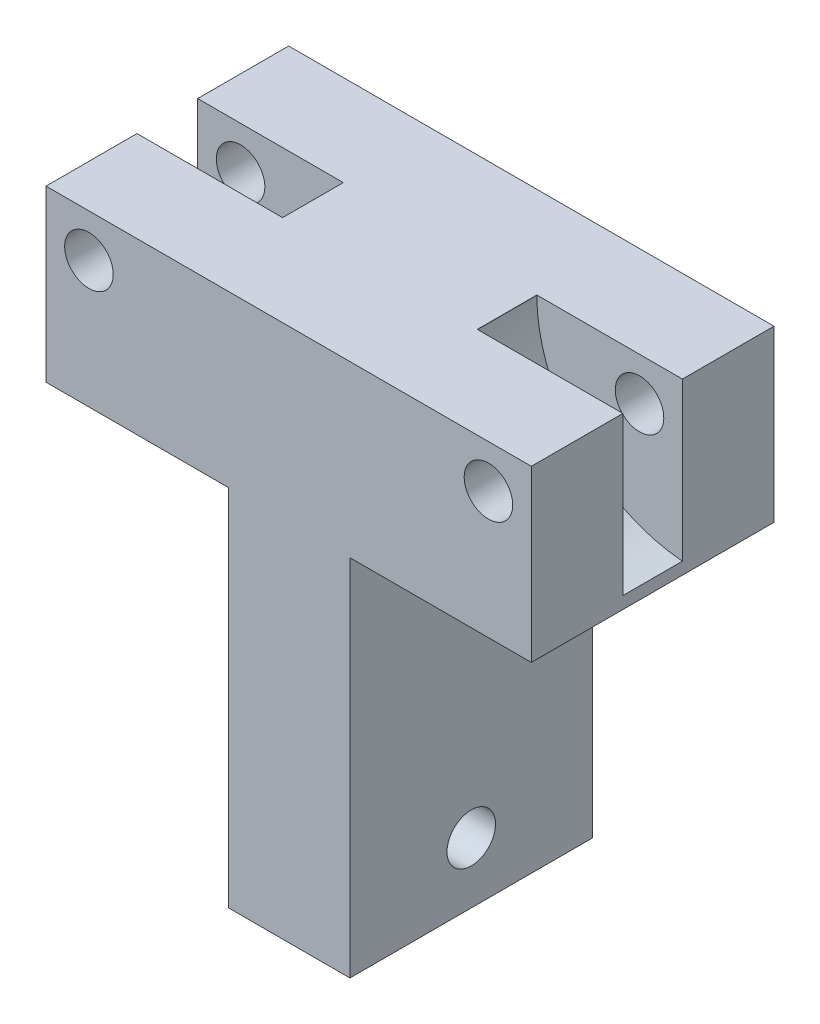
ISO-10303-21;
HEADER;
FILE_DESCRIPTION(('STEP AP214'),'2;1');
FILE_NAME('part.step','',(''),(''),'','','');
FILE_SCHEMA(('AUTOMOTIVE_DESIGN { 1 0 10303 214 1 1 1 1 }'));
ENDSEC;
DATA;
#1=APPLICATION_CONTEXT('core data for automotive mechanical design processes');
#2=APPLICATION_PROTOCOL_DEFINITION('international standard','automotive_design',2000,#1);
#3=PRODUCT_CONTEXT('',#1,'mechanical');
#4=PRODUCT('Part','Part','',(#3));
#5=PRODUCT_RELATED_PRODUCT_CATEGORY('part','',(#4));
#6=PRODUCT_DEFINITION_FORMATION('','',#4);
#7=PRODUCT_DEFINITION_CONTEXT('part definition',#1,'design');
#8=PRODUCT_DEFINITION('design','',#6,#7);
#9=PRODUCT_DEFINITION_SHAPE('','',#8);
#10=(LENGTH_UNIT() NAMED_UNIT(*) SI_UNIT(.MILLI.,.METRE.));
#11=(NAMED_UNIT(*) PLANE_ANGLE_UNIT() SI_UNIT($,.RADIAN.));
#12=(NAMED_UNIT(*) SI_UNIT($,.STERADIAN.) SOLID_ANGLE_UNIT());
#13=UNCERTAINTY_MEASURE_WITH_UNIT(LENGTH_MEASURE(1.E-05),#10,'distance_accuracy_value','');
#14=(GEOMETRIC_REPRESENTATION_CONTEXT(3) GLOBAL_UNCERTAINTY_ASSIGNED_CONTEXT((#13)) GLOBAL_UNIT_ASSIGNED_CONTEXT((#10,
#11,#12)) REPRESENTATION_CONTEXT('',''));
#15=CARTESIAN_POINT('',(0.,0.,0.));
#16=DIRECTION('',(0.,0.,1.));
#17=DIRECTION('',(1.,0.,0.));
#18=AXIS2_PLACEMENT_3D('',#15,#16,#17);
#19=CARTESIAN_POINT('',(2.5,15.,-10.));
#20=DIRECTION('',(-1.,0.,0.));
#21=DIRECTION('',(0.,0.,1.));
#22=AXIS2_PLACEMENT_3D('',#19,#20,#21);
#23=PLANE('',#22);
#24=CARTESIAN_POINT('',(2.5,2.5,-5.));
#25=DIRECTION('',(1.,0.,0.));
#26=DIRECTION('',(0.,0.,-1.));
#27=AXIS2_PLACEMENT_3D('',#24,#25,#26);
#28=CIRCLE('',#27,1.);
#29=CARTESIAN_POINT('',(2.5,2.5,-6.));
#30=VERTEX_POINT('',#29);
#31=EDGE_CURVE('E238',#30,#30,#28,.T.);
#32=ORIENTED_EDGE('',*,*,#31,.F.);
#33=EDGE_LOOP('',(#32));
#34=FACE_BOUND('',#33,.T.);
#35=DIRECTION('',(0.,0.,-1.));
#36=VECTOR('',#35,1.);
#37=CARTESIAN_POINT('',(2.5,0.,-10.));
#38=LINE('',#37,#36);
#39=CARTESIAN_POINT('',(2.5,0.,0.));
#40=VERTEX_POINT('',#39);
#41=CARTESIAN_POINT('',(2.5,0.,-10.));
#42=VERTEX_POINT('',#41);
#43=EDGE_CURVE('E242',#40,#42,#38,.T.);
#44=ORIENTED_EDGE('',*,*,#43,.T.);
#45=DIRECTION('',(0.,-1.,0.));
#46=VECTOR('',#45,1.);
#47=CARTESIAN_POINT('',(2.5,15.,-10.));
#48=LINE('',#47,#46);
#49=CARTESIAN_POINT('',(2.5,15.,-10.));
#50=VERTEX_POINT('',#49);
#51=EDGE_CURVE('E268',#50,#42,#48,.T.);
#52=ORIENTED_EDGE('',*,*,#51,.F.);
#53=DIRECTION('',(0.,0.,-1.));
#54=VECTOR('',#53,1.);
#55=CARTESIAN_POINT('',(2.5,15.,-10.));
#56=LINE('',#55,#54);
#57=CARTESIAN_POINT('',(2.5,15.,0.));
#58=VERTEX_POINT('',#57);
#59=EDGE_CURVE('E245',#58,#50,#56,.T.);
#60=ORIENTED_EDGE('',*,*,#59,.F.);
#61=DIRECTION('',(0.,-1.,0.));
#62=VECTOR('',#61,1.);
#63=CARTESIAN_POINT('',(2.5,15.,0.));
#64=LINE('',#63,#62);
#65=EDGE_CURVE('E252',#58,#40,#64,.T.);
#66=ORIENTED_EDGE('',*,*,#65,.T.);
#67=EDGE_LOOP('',(#44,#52,#60,#66));
#68=FACE_BOUND('',#67,.T.);
#69=ADVANCED_FACE('F37',(#34,#68),#23,.F.);
#70=CARTESIAN_POINT('',(-2.5,15.,-10.));
#71=DIRECTION('',(0.,0.,1.));
#72=DIRECTION('',(1.,0.,0.));
#73=AXIS2_PLACEMENT_3D('',#70,#71,#72);
#74=PLANE('',#73);
#75=CARTESIAN_POINT('',(8.20740930189963,20.2322330470336,-10.));
#76=DIRECTION('',(0.,0.,-1.));
#77=DIRECTION('',(-1.,0.,0.));
#78=AXIS2_PLACEMENT_3D('',#75,#76,#77);
#79=CIRCLE('',#78,1.);
#80=CARTESIAN_POINT('',(7.20740930189963,20.2322330470336,-10.));
#81=VERTEX_POINT('',#80);
#82=EDGE_CURVE('E301',#81,#81,#79,.T.);
#83=ORIENTED_EDGE('',*,*,#82,.F.);
#84=EDGE_LOOP('',(#83));
#85=FACE_BOUND('',#84,.T.);
#86=CARTESIAN_POINT('',(-8.25705679216763,20.2322330470336,-10.));
#87=DIRECTION('',(0.,0.,-1.));
#88=DIRECTION('',(-1.,0.,0.));
#89=AXIS2_PLACEMENT_3D('',#86,#87,#88);
#90=CIRCLE('',#89,1.);
#91=CARTESIAN_POINT('',(-9.25705679216763,20.2322330470336,-10.));
#92=VERTEX_POINT('',#91);
#93=EDGE_CURVE('E167',#92,#92,#90,.T.);
#94=ORIENTED_EDGE('',*,*,#93,.F.);
#95=EDGE_LOOP('',(#94));
#96=FACE_BOUND('',#95,.T.);
#97=DIRECTION('',(-1.,0.,0.));
#98=VECTOR('',#97,1.);
#99=CARTESIAN_POINT('',(-2.5,0.,-10.));
#100=LINE('',#99,#98);
#101=CARTESIAN_POINT('',(-2.5,0.,-10.));
#102=VERTEX_POINT('',#101);
#103=EDGE_CURVE('E255',#42,#102,#100,.T.);
#104=ORIENTED_EDGE('',*,*,#103,.T.);
#105=DIRECTION('',(0.,-1.,0.));
#106=VECTOR('',#105,1.);
#107=CARTESIAN_POINT('',(-2.5,15.,-10.));
#108=LINE('',#107,#106);
#109=CARTESIAN_POINT('',(-2.5,15.,-10.));
#110=VERTEX_POINT('',#109);
#111=EDGE_CURVE('E265',#110,#102,#108,.T.);
#112=ORIENTED_EDGE('',*,*,#111,.F.);
#113=DIRECTION('',(-1.,0.,0.));
#114=VECTOR('',#113,1.);
#115=CARTESIAN_POINT('',(-10.024823745134,15.,-10.));
#116=LINE('',#115,#114);
#117=CARTESIAN_POINT('',(-10.024823745134,15.,-10.));
#118=VERTEX_POINT('',#117);
#119=EDGE_CURVE('E217',#110,#118,#116,.T.);
#120=ORIENTED_EDGE('',*,*,#119,.T.);
#121=DIRECTION('',(0.,-1.,0.));
#122=VECTOR('',#121,1.);
#123=CARTESIAN_POINT('',(-10.024823745134,22.,-10.));
#124=LINE('',#123,#122);
#125=CARTESIAN_POINT('',(-10.024823745134,22.,-10.));
#126=VERTEX_POINT('',#125);
#127=EDGE_CURVE('E232',#126,#118,#124,.T.);
#128=ORIENTED_EDGE('',*,*,#127,.F.);
#129=DIRECTION('',(-1.,0.,0.));
#130=VECTOR('',#129,1.);
#131=CARTESIAN_POINT('',(-10.024823745134,22.,-10.));
#132=LINE('',#131,#130);
#133=CARTESIAN_POINT('',(9.97517625486601,22.,-10.));
#134=VERTEX_POINT('',#133);
#135=EDGE_CURVE('E205',#134,#126,#132,.T.);
#136=ORIENTED_EDGE('',*,*,#135,.F.);
#137=DIRECTION('',(0.,-1.,0.));
#138=VECTOR('',#137,1.);
#139=CARTESIAN_POINT('',(9.97517625486601,22.,-10.));
#140=LINE('',#139,#138);
#141=CARTESIAN_POINT('',(9.97517625486601,15.,-10.));
#142=VERTEX_POINT('',#141);
#143=EDGE_CURVE('E235',#134,#142,#140,.T.);
#144=ORIENTED_EDGE('',*,*,#143,.T.);
#145=EDGE_CURVE('E218',#142,#50,#116,.T.);
#146=ORIENTED_EDGE('',*,*,#145,.T.);
#147=ORIENTED_EDGE('',*,*,#51,.T.);
#148=EDGE_LOOP('',(#104,#112,#120,#128,#136,#144,#146,#147));
#149=FACE_BOUND('',#148,.T.);
#150=ADVANCED_FACE('F328',(#85,#96,#149),#74,.F.);
#151=CARTESIAN_POINT('',(-2.5,15.,0.));
#152=DIRECTION('',(1.,0.,0.));
#153=DIRECTION('',(0.,0.,-1.));
#154=AXIS2_PLACEMENT_3D('',#151,#152,#153);
#155=PLANE('',#154);
#156=CARTESIAN_POINT('',(-2.5,2.5,-5.));
#157=DIRECTION('',(1.,0.,0.));
#158=DIRECTION('',(0.,0.,-1.));
#159=AXIS2_PLACEMENT_3D('',#156,#157,#158);
#160=CIRCLE('',#159,1.);
#161=CARTESIAN_POINT('',(-2.5,2.5,-6.));
#162=VERTEX_POINT('',#161);
#163=EDGE_CURVE('E239',#162,#162,#160,.T.);
#164=ORIENTED_EDGE('',*,*,#163,.T.);
#165=EDGE_LOOP('',(#164));
#166=FACE_BOUND('',#165,.T.);
#167=DIRECTION('',(0.,0.,1.));
#168=VECTOR('',#167,1.);
#169=CARTESIAN_POINT('',(-2.5,0.,0.));
#170=LINE('',#169,#168);
#171=CARTESIAN_POINT('',(-2.5,0.,0.));
#172=VERTEX_POINT('',#171);
#173=EDGE_CURVE('E257',#102,#172,#170,.T.);
#174=ORIENTED_EDGE('',*,*,#173,.T.);
#175=DIRECTION('',(0.,-1.,0.));
#176=VECTOR('',#175,1.);
#177=CARTESIAN_POINT('',(-2.5,15.,0.));
#178=LINE('',#177,#176);
#179=CARTESIAN_POINT('',(-2.5,15.,0.));
#180=VERTEX_POINT('',#179);
#181=EDGE_CURVE('E262',#180,#172,#178,.T.);
#182=ORIENTED_EDGE('',*,*,#181,.F.);
#183=DIRECTION('',(0.,0.,1.));
#184=VECTOR('',#183,1.);
#185=CARTESIAN_POINT('',(-2.5,15.,0.));
#186=LINE('',#185,#184);
#187=EDGE_CURVE('E248',#110,#180,#186,.T.);
#188=ORIENTED_EDGE('',*,*,#187,.F.);
#189=ORIENTED_EDGE('',*,*,#111,.T.);
#190=EDGE_LOOP('',(#174,#182,#188,#189));
#191=FACE_BOUND('',#190,.T.);
#192=ADVANCED_FACE('F336',(#166,#191),#155,.F.);
#193=CARTESIAN_POINT('',(-2.5,15.,0.));
#194=DIRECTION('',(0.,0.,-1.));
#195=DIRECTION('',(-1.,0.,0.));
#196=AXIS2_PLACEMENT_3D('',#193,#194,#195);
#197=PLANE('',#196);
#198=CARTESIAN_POINT('',(8.20740930189964,20.2322330470336,0.));
#199=DIRECTION('',(0.,0.,-1.));
#200=DIRECTION('',(-1.,0.,0.));
#201=AXIS2_PLACEMENT_3D('',#198,#199,#200);
#202=CIRCLE('',#201,1.);
#203=CARTESIAN_POINT('',(7.20740930189964,20.2322330470336,0.));
#204=VERTEX_POINT('',#203);
#205=EDGE_CURVE('E278',#204,#204,#202,.T.);
#206=ORIENTED_EDGE('',*,*,#205,.T.);
#207=EDGE_LOOP('',(#206));
#208=FACE_BOUND('',#207,.T.);
#209=CARTESIAN_POINT('',(-8.25705679216762,20.2322330470336,0.));
#210=DIRECTION('',(0.,0.,-1.));
#211=DIRECTION('',(-1.,0.,0.));
#212=AXIS2_PLACEMENT_3D('',#209,#210,#211);
#213=CIRCLE('',#212,1.);
#214=CARTESIAN_POINT('',(-9.25705679216762,20.2322330470336,0.));
#215=VERTEX_POINT('',#214);
#216=EDGE_CURVE('E170',#215,#215,#213,.T.);
#217=ORIENTED_EDGE('',*,*,#216,.T.);
#218=EDGE_LOOP('',(#217));
#219=FACE_BOUND('',#218,.T.);
#220=DIRECTION('',(1.,0.,0.));
#221=VECTOR('',#220,1.);
#222=CARTESIAN_POINT('',(-2.5,0.,0.));
#223=LINE('',#222,#221);
#224=EDGE_CURVE('E249',#172,#40,#223,.T.);
#225=ORIENTED_EDGE('',*,*,#224,.T.);
#226=ORIENTED_EDGE('',*,*,#65,.F.);
#227=DIRECTION('',(1.,0.,0.));
#228=VECTOR('',#227,1.);
#229=CARTESIAN_POINT('',(9.97517625486601,15.,0.));
#230=LINE('',#229,#228);
#231=CARTESIAN_POINT('',(9.97517625486601,15.,0.));
#232=VERTEX_POINT('',#231);
#233=EDGE_CURVE('E223',#58,#232,#230,.T.);
#234=ORIENTED_EDGE('',*,*,#233,.T.);
#235=DIRECTION('',(0.,-1.,0.));
#236=VECTOR('',#235,1.);
#237=CARTESIAN_POINT('',(9.97517625486601,22.,0.));
#238=LINE('',#237,#236);
#239=CARTESIAN_POINT('',(9.97517625486601,22.,0.));
#240=VERTEX_POINT('',#239);
#241=EDGE_CURVE('E214',#240,#232,#238,.T.);
#242=ORIENTED_EDGE('',*,*,#241,.F.);
#243=DIRECTION('',(1.,0.,0.));
#244=VECTOR('',#243,1.);
#245=CARTESIAN_POINT('',(9.97517625486601,22.,0.));
#246=LINE('',#245,#244);
#247=CARTESIAN_POINT('',(-10.024823745134,22.,0.));
#248=VERTEX_POINT('',#247);
#249=EDGE_CURVE('E212',#248,#240,#246,.T.);
#250=ORIENTED_EDGE('',*,*,#249,.F.);
#251=DIRECTION('',(0.,-1.,0.));
#252=VECTOR('',#251,1.);
#253=CARTESIAN_POINT('',(-10.024823745134,22.,0.));
#254=LINE('',#253,#252);
#255=CARTESIAN_POINT('',(-10.024823745134,15.,0.));
#256=VERTEX_POINT('',#255);
#257=EDGE_CURVE('E229',#248,#256,#254,.T.);
#258=ORIENTED_EDGE('',*,*,#257,.T.);
#259=EDGE_CURVE('E224',#256,#180,#230,.T.);
#260=ORIENTED_EDGE('',*,*,#259,.T.);
#261=ORIENTED_EDGE('',*,*,#181,.T.);
#262=EDGE_LOOP('',(#225,#226,#234,#242,#250,#258,#260,#261));
#263=FACE_BOUND('',#262,.T.);
#264=ADVANCED_FACE('F307',(#208,#219,#263),#197,.F.);
#265=CARTESIAN_POINT('',(0.,0.,0.));
#266=DIRECTION('',(0.,1.,0.));
#267=DIRECTION('',(0.,0.,1.));
#268=AXIS2_PLACEMENT_3D('',#265,#266,#267);
#269=PLANE('',#268);
#270=ORIENTED_EDGE('',*,*,#43,.F.);
#271=ORIENTED_EDGE('',*,*,#224,.F.);
#272=ORIENTED_EDGE('',*,*,#173,.F.);
#273=ORIENTED_EDGE('',*,*,#103,.F.);
#274=EDGE_LOOP('',(#270,#271,#272,#273));
#275=FACE_BOUND('',#274,.T.);
#276=ADVANCED_FACE('F392',(#275),#269,.F.);
#277=CARTESIAN_POINT('',(-2.5,2.5,-5.));
#278=DIRECTION('',(1.,0.,0.));
#279=DIRECTION('',(0.,0.,-1.));
#280=AXIS2_PLACEMENT_3D('',#277,#278,#279);
#281=CYLINDRICAL_SURFACE('',#280,1.);
#282=ORIENTED_EDGE('',*,*,#163,.F.);
#283=EDGE_LOOP('',(#282));
#284=FACE_BOUND('',#283,.T.);
#285=ORIENTED_EDGE('',*,*,#31,.T.);
#286=EDGE_LOOP('',(#285));
#287=FACE_BOUND('',#286,.T.);
#288=ADVANCED_FACE('F402',(#284,#287),#281,.F.);
#289=CARTESIAN_POINT('',(0.,15.,0.));
#290=DIRECTION('',(0.,-1.,0.));
#291=DIRECTION('',(0.,0.,-1.));
#292=AXIS2_PLACEMENT_3D('',#289,#290,#291);
#293=PLANE('',#292);
#294=ORIENTED_EDGE('',*,*,#233,.F.);
#295=ORIENTED_EDGE('',*,*,#59,.T.);
#296=ORIENTED_EDGE('',*,*,#145,.F.);
#297=DIRECTION('',(0.,0.,-1.));
#298=VECTOR('',#297,1.);
#299=CARTESIAN_POINT('',(9.97517625486601,15.,-10.));
#300=LINE('',#299,#298);
#301=EDGE_CURVE('E201',#232,#142,#300,.T.);
#302=ORIENTED_EDGE('',*,*,#301,.F.);
#303=EDGE_LOOP('',(#294,#295,#296,#302));
#304=FACE_BOUND('',#303,.T.);
#305=ADVANCED_FACE('F378',(#304),#293,.T.);
#306=CARTESIAN_POINT('',(9.97517625486601,22.,-10.));
#307=DIRECTION('',(-1.,0.,0.));
#308=DIRECTION('',(0.,0.,1.));
#309=AXIS2_PLACEMENT_3D('',#306,#307,#308);
#310=PLANE('',#309);
#311=DIRECTION('',(0.,0.,-1.));
#312=VECTOR('',#311,1.);
#313=CARTESIAN_POINT('',(9.97517625486601,22.,-10.));
#314=LINE('',#313,#312);
#315=CARTESIAN_POINT('',(9.97517625486601,22.,-6.22665925051405));
#316=VERTEX_POINT('',#315);
#317=EDGE_CURVE('E206',#316,#134,#314,.T.);
#318=ORIENTED_EDGE('',*,*,#317,.F.);
#319=DIRECTION('',(0.,1.,0.));
#320=VECTOR('',#319,1.);
#321=CARTESIAN_POINT('',(9.97517625486601,22.,-6.22665925051405));
#322=LINE('',#321,#320);
#323=CARTESIAN_POINT('',(9.97517625486601,15.5,-6.22665925051405));
#324=VERTEX_POINT('',#323);
#325=EDGE_CURVE('E289',#324,#316,#322,.T.);
#326=ORIENTED_EDGE('',*,*,#325,.F.);
#327=DIRECTION('',(0.,0.,-1.));
#328=VECTOR('',#327,1.);
#329=CARTESIAN_POINT('',(9.97517625486601,15.5,-3.77334074948595));
#330=LINE('',#329,#328);
#331=CARTESIAN_POINT('',(9.97517625486601,15.5,-3.77334074948595));
#332=VERTEX_POINT('',#331);
#333=EDGE_CURVE('E174',#332,#324,#330,.T.);
#334=ORIENTED_EDGE('',*,*,#333,.F.);
#335=DIRECTION('',(0.,-1.,0.));
#336=VECTOR('',#335,1.);
#337=CARTESIAN_POINT('',(9.97517625486601,22.,-3.77334074948595));
#338=LINE('',#337,#336);
#339=CARTESIAN_POINT('',(9.97517625486601,22.,-3.77334074948595));
#340=VERTEX_POINT('',#339);
#341=EDGE_CURVE('E295',#340,#332,#338,.T.);
#342=ORIENTED_EDGE('',*,*,#341,.F.);
#343=EDGE_CURVE('E166',#240,#340,#314,.T.);
#344=ORIENTED_EDGE('',*,*,#343,.F.);
#345=ORIENTED_EDGE('',*,*,#241,.T.);
#346=ORIENTED_EDGE('',*,*,#301,.T.);
#347=ORIENTED_EDGE('',*,*,#143,.F.);
#348=EDGE_LOOP('',(#318,#326,#334,#342,#344,#345,#346,#347));
#349=FACE_BOUND('',#348,.T.);
#350=ADVANCED_FACE('F293',(#349),#310,.F.);
#351=CARTESIAN_POINT('',(-10.024823745134,22.,0.));
#352=DIRECTION('',(1.,0.,0.));
#353=DIRECTION('',(0.,0.,-1.));
#354=AXIS2_PLACEMENT_3D('',#351,#352,#353);
#355=PLANE('',#354);
#356=DIRECTION('',(0.,0.,1.));
#357=VECTOR('',#356,1.);
#358=CARTESIAN_POINT('',(-10.024823745134,22.,0.));
#359=LINE('',#358,#357);
#360=CARTESIAN_POINT('',(-10.024823745134,22.,-3.75));
#361=VERTEX_POINT('',#360);
#362=EDGE_CURVE('E208',#361,#248,#359,.T.);
#363=ORIENTED_EDGE('',*,*,#362,.F.);
#364=DIRECTION('',(0.,1.,0.));
#365=VECTOR('',#364,1.);
#366=CARTESIAN_POINT('',(-10.024823745134,22.,-3.75));
#367=LINE('',#366,#365);
#368=CARTESIAN_POINT('',(-10.024823745134,15.5,-3.75));
#369=VERTEX_POINT('',#368);
#370=EDGE_CURVE('E183',#369,#361,#367,.T.);
#371=ORIENTED_EDGE('',*,*,#370,.F.);
#372=DIRECTION('',(0.,0.,1.));
#373=VECTOR('',#372,1.);
#374=CARTESIAN_POINT('',(-10.024823745134,15.5,-3.75));
#375=LINE('',#374,#373);
#376=CARTESIAN_POINT('',(-10.024823745134,15.5,-6.25));
#377=VERTEX_POINT('',#376);
#378=EDGE_CURVE('E187',#377,#369,#375,.T.);
#379=ORIENTED_EDGE('',*,*,#378,.F.);
#380=DIRECTION('',(0.,-1.,0.));
#381=VECTOR('',#380,1.);
#382=CARTESIAN_POINT('',(-10.024823745134,15.5,-6.25));
#383=LINE('',#382,#381);
#384=CARTESIAN_POINT('',(-10.024823745134,22.,-6.25));
#385=VERTEX_POINT('',#384);
#386=EDGE_CURVE('E195',#385,#377,#383,.T.);
#387=ORIENTED_EDGE('',*,*,#386,.F.);
#388=EDGE_CURVE('E209',#126,#385,#359,.T.);
#389=ORIENTED_EDGE('',*,*,#388,.F.);
#390=ORIENTED_EDGE('',*,*,#127,.T.);
#391=DIRECTION('',(0.,0.,1.));
#392=VECTOR('',#391,1.);
#393=CARTESIAN_POINT('',(-10.024823745134,15.,0.));
#394=LINE('',#393,#392);
#395=EDGE_CURVE('E221',#118,#256,#394,.T.);
#396=ORIENTED_EDGE('',*,*,#395,.T.);
#397=ORIENTED_EDGE('',*,*,#257,.F.);
#398=EDGE_LOOP('',(#363,#371,#379,#387,#389,#390,#396,#397));
#399=FACE_BOUND('',#398,.T.);
#400=ADVANCED_FACE('F365',(#399),#355,.F.);
#401=CARTESIAN_POINT('',(0.,22.,0.));
#402=DIRECTION('',(0.,-1.,0.));
#403=DIRECTION('',(0.,0.,-1.));
#404=AXIS2_PLACEMENT_3D('',#401,#402,#403);
#405=PLANE('',#404);
#406=DIRECTION('',(0.,0.,1.));
#407=VECTOR('',#406,1.);
#408=CARTESIAN_POINT('',(3.97517625486601,22.,-3.77334074948595));
#409=LINE('',#408,#407);
#410=CARTESIAN_POINT('',(3.97517625486601,22.,-6.22665925051405));
#411=VERTEX_POINT('',#410);
#412=CARTESIAN_POINT('',(3.97517625486601,22.,-3.77334074948595));
#413=VERTEX_POINT('',#412);
#414=EDGE_CURVE('E153',#411,#413,#409,.T.);
#415=ORIENTED_EDGE('',*,*,#414,.F.);
#416=DIRECTION('',(1.,0.,0.));
#417=VECTOR('',#416,1.);
#418=CARTESIAN_POINT('',(3.97517625486601,22.,-6.22665925051405));
#419=LINE('',#418,#417);
#420=EDGE_CURVE('E152',#411,#316,#419,.T.);
#421=ORIENTED_EDGE('',*,*,#420,.T.);
#422=ORIENTED_EDGE('',*,*,#317,.T.);
#423=ORIENTED_EDGE('',*,*,#135,.T.);
#424=ORIENTED_EDGE('',*,*,#388,.T.);
#425=DIRECTION('',(-1.,0.,0.));
#426=VECTOR('',#425,1.);
#427=CARTESIAN_POINT('',(-4.02482374513399,22.,-6.25));
#428=LINE('',#427,#426);
#429=CARTESIAN_POINT('',(-4.02482374513399,22.,-6.25));
#430=VERTEX_POINT('',#429);
#431=EDGE_CURVE('E199',#430,#385,#428,.T.);
#432=ORIENTED_EDGE('',*,*,#431,.F.);
#433=DIRECTION('',(0.,0.,-1.));
#434=VECTOR('',#433,1.);
#435=CARTESIAN_POINT('',(-4.02482374513399,22.,-6.25));
#436=LINE('',#435,#434);
#437=CARTESIAN_POINT('',(-4.02482374513399,22.,-3.75));
#438=VERTEX_POINT('',#437);
#439=EDGE_CURVE('E186',#438,#430,#436,.T.);
#440=ORIENTED_EDGE('',*,*,#439,.F.);
#441=DIRECTION('',(-1.,0.,0.));
#442=VECTOR('',#441,1.);
#443=CARTESIAN_POINT('',(-4.02482374513399,22.,-3.75));
#444=LINE('',#443,#442);
#445=EDGE_CURVE('E193',#438,#361,#444,.T.);
#446=ORIENTED_EDGE('',*,*,#445,.T.);
#447=ORIENTED_EDGE('',*,*,#362,.T.);
#448=ORIENTED_EDGE('',*,*,#249,.T.);
#449=ORIENTED_EDGE('',*,*,#343,.T.);
#450=DIRECTION('',(1.,0.,0.));
#451=VECTOR('',#450,1.);
#452=CARTESIAN_POINT('',(3.97517625486601,22.,-3.77334074948595));
#453=LINE('',#452,#451);
#454=EDGE_CURVE('E149',#413,#340,#453,.T.);
#455=ORIENTED_EDGE('',*,*,#454,.F.);
#456=EDGE_LOOP('',(#415,#421,#422,#423,#424,#432,#440,#446,#447,#448,#449,#455));
#457=FACE_BOUND('',#456,.T.);
#458=ADVANCED_FACE('F164',(#457),#405,.F.);
#459=ORIENTED_EDGE('',*,*,#119,.F.);
#460=ORIENTED_EDGE('',*,*,#187,.T.);
#461=ORIENTED_EDGE('',*,*,#259,.F.);
#462=ORIENTED_EDGE('',*,*,#395,.F.);
#463=EDGE_LOOP('',(#459,#460,#461,#462));
#464=FACE_BOUND('',#463,.T.);
#465=ADVANCED_FACE('F385',(#464),#293,.T.);
#466=CARTESIAN_POINT('',(-4.02482374513399,22.,-3.75));
#467=DIRECTION('',(0.,0.,1.));
#468=DIRECTION('',(0.,-1.,0.));
#469=AXIS2_PLACEMENT_3D('',#466,#467,#468);
#470=PLANE('',#469);
#471=CARTESIAN_POINT('',(-8.25705679216762,20.2322330470336,-3.75));
#472=DIRECTION('',(0.,0.,1.));
#473=DIRECTION('',(0.,-1.,0.));
#474=AXIS2_PLACEMENT_3D('',#471,#472,#473);
#475=CIRCLE('',#474,1.);
#476=CARTESIAN_POINT('',(-8.25705679216762,19.2322330470336,-3.75));
#477=VERTEX_POINT('',#476);
#478=EDGE_CURVE('E180',#477,#477,#475,.T.);
#479=ORIENTED_EDGE('',*,*,#478,.T.);
#480=EDGE_LOOP('',(#479));
#481=FACE_BOUND('',#480,.T.);
#482=DIRECTION('',(0.,1.,0.));
#483=VECTOR('',#482,1.);
#484=CARTESIAN_POINT('',(-4.02482374513399,22.,-3.75));
#485=LINE('',#484,#483);
#486=CARTESIAN_POINT('',(-4.02482374513399,21.9807406984079,-3.75));
#487=VERTEX_POINT('',#486);
#488=EDGE_CURVE('E184',#487,#438,#485,.T.);
#489=ORIENTED_EDGE('',*,*,#488,.F.);
#490=CARTESIAN_POINT('',(-10.524823745134,21.9807406984079,-3.75));
#491=DIRECTION('',(0.,0.,1.));
#492=DIRECTION('',(0.,-1.,0.));
#493=AXIS2_PLACEMENT_3D('',#490,#491,#492);
#494=CIRCLE('',#493,6.5);
#495=EDGE_CURVE('E281',#487,#369,#494,.F.);
#496=ORIENTED_EDGE('',*,*,#495,.T.);
#497=ORIENTED_EDGE('',*,*,#370,.T.);
#498=ORIENTED_EDGE('',*,*,#445,.F.);
#499=EDGE_LOOP('',(#489,#496,#497,#498));
#500=FACE_BOUND('',#499,.T.);
#501=ADVANCED_FACE('F369',(#481,#500),#470,.F.);
#502=CARTESIAN_POINT('',(-4.02482374513399,15.5,-6.25));
#503=DIRECTION('',(0.,0.,-1.));
#504=DIRECTION('',(0.,1.,0.));
#505=AXIS2_PLACEMENT_3D('',#502,#503,#504);
#506=PLANE('',#505);
#507=CARTESIAN_POINT('',(-8.25705679216762,20.2322330470336,-6.25));
#508=DIRECTION('',(0.,0.,-1.));
#509=DIRECTION('',(0.,1.,0.));
#510=AXIS2_PLACEMENT_3D('',#507,#508,#509);
#511=CIRCLE('',#510,1.);
#512=CARTESIAN_POINT('',(-8.25705679216762,21.2322330470336,-6.25));
#513=VERTEX_POINT('',#512);
#514=EDGE_CURVE('E178',#513,#513,#511,.T.);
#515=ORIENTED_EDGE('',*,*,#514,.T.);
#516=EDGE_LOOP('',(#515));
#517=FACE_BOUND('',#516,.T.);
#518=ORIENTED_EDGE('',*,*,#386,.T.);
#519=CARTESIAN_POINT('',(-10.524823745134,21.9807406984079,-6.25));
#520=DIRECTION('',(0.,0.,-1.));
#521=DIRECTION('',(0.,1.,0.));
#522=AXIS2_PLACEMENT_3D('',#519,#520,#521);
#523=CIRCLE('',#522,6.5);
#524=CARTESIAN_POINT('',(-4.02482374513399,21.9807406984079,-6.25));
#525=VERTEX_POINT('',#524);
#526=EDGE_CURVE('E283',#377,#525,#523,.F.);
#527=ORIENTED_EDGE('',*,*,#526,.T.);
#528=DIRECTION('',(0.,-1.,0.));
#529=VECTOR('',#528,1.);
#530=CARTESIAN_POINT('',(-4.02482374513399,15.5,-6.25));
#531=LINE('',#530,#529);
#532=EDGE_CURVE('E190',#430,#525,#531,.T.);
#533=ORIENTED_EDGE('',*,*,#532,.F.);
#534=ORIENTED_EDGE('',*,*,#431,.T.);
#535=EDGE_LOOP('',(#518,#527,#533,#534));
#536=FACE_BOUND('',#535,.T.);
#537=ADVANCED_FACE('F354',(#517,#536),#506,.F.);
#538=CARTESIAN_POINT('',(-4.02482374513399,0.,0.));
#539=DIRECTION('',(1.,0.,0.));
#540=DIRECTION('',(0.,0.,-1.));
#541=AXIS2_PLACEMENT_3D('',#538,#539,#540);
#542=PLANE('',#541);
#543=ORIENTED_EDGE('',*,*,#532,.T.);
#544=DIRECTION('',(0.,0.,1.));
#545=VECTOR('',#544,1.);
#546=CARTESIAN_POINT('',(-4.02482374513399,21.9807406984079,0.));
#547=LINE('',#546,#545);
#548=EDGE_CURVE('E271',#525,#487,#547,.T.);
#549=ORIENTED_EDGE('',*,*,#548,.T.);
#550=ORIENTED_EDGE('',*,*,#488,.T.);
#551=ORIENTED_EDGE('',*,*,#439,.T.);
#552=EDGE_LOOP('',(#543,#549,#550,#551));
#553=FACE_BOUND('',#552,.T.);
#554=ADVANCED_FACE('F357',(#553),#542,.F.);
#555=CARTESIAN_POINT('',(-8.25705679216762,20.2322330470336,0.));
#556=DIRECTION('',(0.,0.,-1.));
#557=DIRECTION('',(-1.,0.,0.));
#558=AXIS2_PLACEMENT_3D('',#555,#556,#557);
#559=CYLINDRICAL_SURFACE('',#558,1.);
#560=ORIENTED_EDGE('',*,*,#93,.T.);
#561=EDGE_LOOP('',(#560));
#562=FACE_BOUND('',#561,.T.);
#563=ORIENTED_EDGE('',*,*,#514,.F.);
#564=EDGE_LOOP('',(#563));
#565=FACE_BOUND('',#564,.T.);
#566=ADVANCED_FACE('F421',(#562,#565),#559,.F.);
#567=ORIENTED_EDGE('',*,*,#216,.F.);
#568=EDGE_LOOP('',(#567));
#569=FACE_BOUND('',#568,.T.);
#570=ORIENTED_EDGE('',*,*,#478,.F.);
#571=EDGE_LOOP('',(#570));
#572=FACE_BOUND('',#571,.T.);
#573=ADVANCED_FACE('F324',(#569,#572),#559,.F.);
#574=CARTESIAN_POINT('',(3.97517625486601,22.,-6.22665925051405));
#575=DIRECTION('',(0.,0.,-1.));
#576=DIRECTION('',(0.,1.,0.));
#577=AXIS2_PLACEMENT_3D('',#574,#575,#576);
#578=PLANE('',#577);
#579=CARTESIAN_POINT('',(8.20740930189963,20.2322330470336,-6.22665925051405));
#580=DIRECTION('',(0.,0.,-1.));
#581=DIRECTION('',(0.,1.,0.));
#582=AXIS2_PLACEMENT_3D('',#579,#580,#581);
#583=CIRCLE('',#582,1.);
#584=CARTESIAN_POINT('',(8.20740930189963,21.2322330470336,-6.22665925051405));
#585=VERTEX_POINT('',#584);
#586=EDGE_CURVE('E277',#585,#585,#583,.T.);
#587=ORIENTED_EDGE('',*,*,#586,.T.);
#588=EDGE_LOOP('',(#587));
#589=FACE_BOUND('',#588,.T.);
#590=DIRECTION('',(0.,1.,0.));
#591=VECTOR('',#590,1.);
#592=CARTESIAN_POINT('',(3.97517625486601,22.,-6.22665925051405));
#593=LINE('',#592,#591);
#594=CARTESIAN_POINT('',(3.97517625486601,21.9807406984079,-6.22665925051405));
#595=VERTEX_POINT('',#594);
#596=EDGE_CURVE('E158',#595,#411,#593,.T.);
#597=ORIENTED_EDGE('',*,*,#596,.F.);
#598=CARTESIAN_POINT('',(10.475176254866,21.9807406984079,-6.22665925051405));
#599=DIRECTION('',(0.,0.,-1.));
#600=DIRECTION('',(0.,1.,0.));
#601=AXIS2_PLACEMENT_3D('',#598,#599,#600);
#602=CIRCLE('',#601,6.5);
#603=EDGE_CURVE('E45',#595,#324,#602,.F.);
#604=ORIENTED_EDGE('',*,*,#603,.T.);
#605=ORIENTED_EDGE('',*,*,#325,.T.);
#606=ORIENTED_EDGE('',*,*,#420,.F.);
#607=EDGE_LOOP('',(#597,#604,#605,#606));
#608=FACE_BOUND('',#607,.T.);
#609=ADVANCED_FACE('F288',(#589,#608),#578,.F.);
#610=CARTESIAN_POINT('',(3.97517625486601,22.,-3.77334074948595));
#611=DIRECTION('',(0.,0.,1.));
#612=DIRECTION('',(1.,0.,0.));
#613=AXIS2_PLACEMENT_3D('',#610,#611,#612);
#614=PLANE('',#613);
#615=CARTESIAN_POINT('',(8.20740930189963,20.2322330470336,-3.77334074948595));
#616=DIRECTION('',(0.,0.,1.));
#617=DIRECTION('',(1.,0.,0.));
#618=AXIS2_PLACEMENT_3D('',#615,#616,#617);
#619=CIRCLE('',#618,1.);
#620=CARTESIAN_POINT('',(9.20740930189963,20.2322330470336,-3.77334074948595));
#621=VERTEX_POINT('',#620);
#622=EDGE_CURVE('E274',#621,#621,#619,.T.);
#623=ORIENTED_EDGE('',*,*,#622,.T.);
#624=EDGE_LOOP('',(#623));
#625=FACE_BOUND('',#624,.T.);
#626=ORIENTED_EDGE('',*,*,#341,.T.);
#627=CARTESIAN_POINT('',(10.475176254866,21.9807406984079,-3.77334074948595));
#628=DIRECTION('',(0.,0.,1.));
#629=DIRECTION('',(1.,0.,0.));
#630=AXIS2_PLACEMENT_3D('',#627,#628,#629);
#631=CIRCLE('',#630,6.5);
#632=CARTESIAN_POINT('',(3.97517625486601,21.9807406984079,-3.77334074948595));
#633=VERTEX_POINT('',#632);
#634=EDGE_CURVE('E11',#332,#633,#631,.F.);
#635=ORIENTED_EDGE('',*,*,#634,.T.);
#636=DIRECTION('',(0.,-1.,0.));
#637=VECTOR('',#636,1.);
#638=CARTESIAN_POINT('',(3.97517625486601,22.,-3.77334074948595));
#639=LINE('',#638,#637);
#640=EDGE_CURVE('E145',#413,#633,#639,.T.);
#641=ORIENTED_EDGE('',*,*,#640,.F.);
#642=ORIENTED_EDGE('',*,*,#454,.T.);
#643=EDGE_LOOP('',(#626,#635,#641,#642));
#644=FACE_BOUND('',#643,.T.);
#645=ADVANCED_FACE('F147',(#625,#644),#614,.F.);
#646=CARTESIAN_POINT('',(3.97517625486601,0.,0.));
#647=DIRECTION('',(1.,0.,0.));
#648=DIRECTION('',(0.,0.,-1.));
#649=AXIS2_PLACEMENT_3D('',#646,#647,#648);
#650=PLANE('',#649);
#651=ORIENTED_EDGE('',*,*,#640,.T.);
#652=DIRECTION('',(0.,0.,1.));
#653=VECTOR('',#652,1.);
#654=CARTESIAN_POINT('',(3.97517625486601,21.9807406984079,-6.22665925051405));
#655=LINE('',#654,#653);
#656=EDGE_CURVE('E285',#633,#595,#655,.F.);
#657=ORIENTED_EDGE('',*,*,#656,.T.);
#658=ORIENTED_EDGE('',*,*,#596,.T.);
#659=ORIENTED_EDGE('',*,*,#414,.T.);
#660=EDGE_LOOP('',(#651,#657,#658,#659));
#661=FACE_BOUND('',#660,.T.);
#662=ADVANCED_FACE('F156',(#661),#650,.T.);
#663=CARTESIAN_POINT('',(8.20740930189964,20.2322330470336,0.));
#664=DIRECTION('',(0.,0.,-1.));
#665=DIRECTION('',(-1.,0.,0.));
#666=AXIS2_PLACEMENT_3D('',#663,#664,#665);
#667=CYLINDRICAL_SURFACE('',#666,1.);
#668=ORIENTED_EDGE('',*,*,#205,.F.);
#669=EDGE_LOOP('',(#668));
#670=FACE_BOUND('',#669,.T.);
#671=ORIENTED_EDGE('',*,*,#622,.F.);
#672=EDGE_LOOP('',(#671));
#673=FACE_BOUND('',#672,.T.);
#674=ADVANCED_FACE('F310',(#670,#673),#667,.F.);
#675=ORIENTED_EDGE('',*,*,#82,.T.);
#676=EDGE_LOOP('',(#675));
#677=FACE_BOUND('',#676,.T.);
#678=ORIENTED_EDGE('',*,*,#586,.F.);
#679=EDGE_LOOP('',(#678));
#680=FACE_BOUND('',#679,.T.);
#681=ADVANCED_FACE('F313',(#677,#680),#667,.F.);
#682=CARTESIAN_POINT('',(-10.524823745134,21.9807406984079,-3.75));
#683=DIRECTION('',(0.,0.,1.));
#684=DIRECTION('',(1.,0.,0.));
#685=AXIS2_PLACEMENT_3D('',#682,#683,#684);
#686=CYLINDRICAL_SURFACE('',#685,6.5);
#687=ORIENTED_EDGE('',*,*,#526,.F.);
#688=ORIENTED_EDGE('',*,*,#378,.T.);
#689=ORIENTED_EDGE('',*,*,#495,.F.);
#690=ORIENTED_EDGE('',*,*,#548,.F.);
#691=EDGE_LOOP('',(#687,#688,#689,#690));
#692=FACE_BOUND('',#691,.T.);
#693=ADVANCED_FACE('F342',(#692),#686,.F.);
#694=CARTESIAN_POINT('',(10.475176254866,21.9807406984079,-3.77334074948595));
#695=DIRECTION('',(0.,0.,-1.));
#696=DIRECTION('',(-1.,0.,0.));
#697=AXIS2_PLACEMENT_3D('',#694,#695,#696);
#698=CYLINDRICAL_SURFACE('',#697,6.5);
#699=ORIENTED_EDGE('',*,*,#634,.F.);
#700=ORIENTED_EDGE('',*,*,#333,.T.);
#701=ORIENTED_EDGE('',*,*,#603,.F.);
#702=ORIENTED_EDGE('',*,*,#656,.F.);
#703=EDGE_LOOP('',(#699,#700,#701,#702));
#704=FACE_BOUND('',#703,.T.);
#705=ADVANCED_FACE('F39',(#704),#698,.F.);
#706=CLOSED_SHELL('',(#69,#150,#192,#264,#276,#288,#305,#350,#400,#458,#465,#501,#537,#554,#566,
#573,#609,#645,#662,#674,#681,#693,#705));
#707=MANIFOLD_SOLID_BREP('B2',#706);
#708=ADVANCED_BREP_SHAPE_REPRESENTATION('',(#18,#707),#14);
#709=SHAPE_DEFINITION_REPRESENTATION(#9,#708);
ENDSEC;
END-ISO-10303-21;
